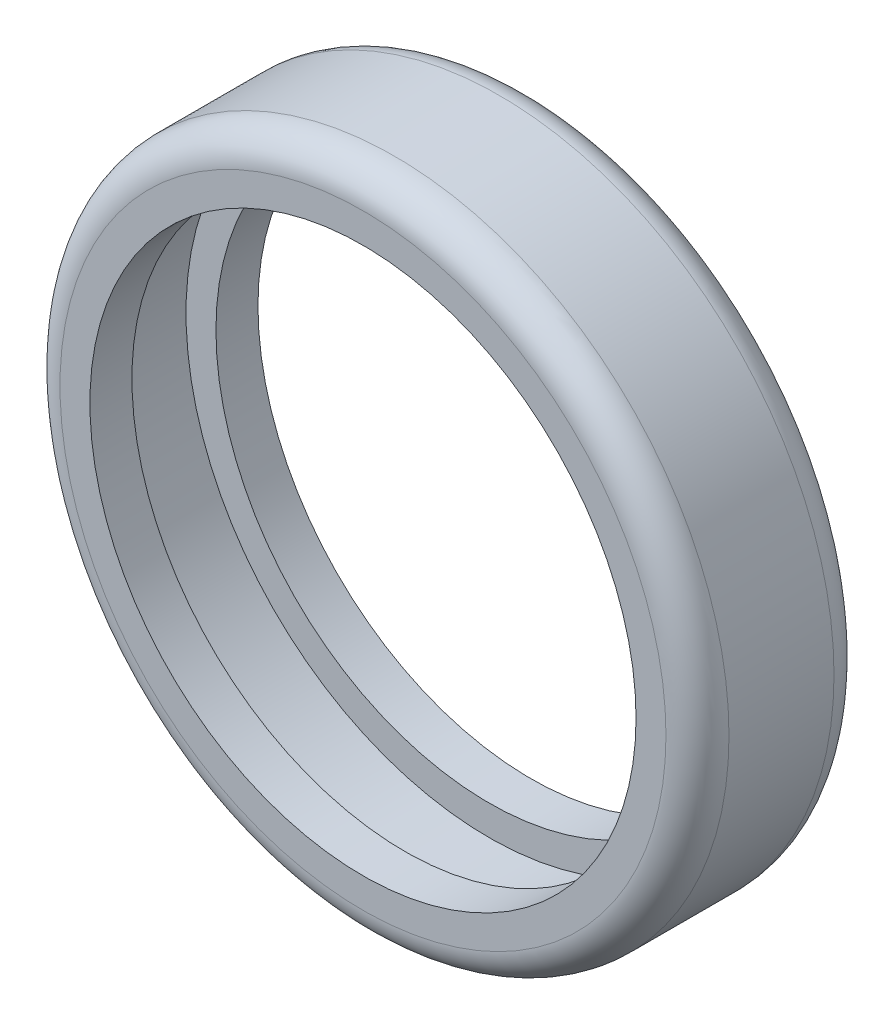
ISO-10303-21;
HEADER;
FILE_DESCRIPTION(('STEP AP214'),'2;1');
FILE_NAME('part.step','',(''),(''),'','','');
FILE_SCHEMA(('AUTOMOTIVE_DESIGN { 1 0 10303 214 1 1 1 1 }'));
ENDSEC;
DATA;
#1=APPLICATION_CONTEXT('core data for automotive mechanical design processes');
#2=APPLICATION_PROTOCOL_DEFINITION('international standard','automotive_design',2000,#1);
#3=PRODUCT_CONTEXT('',#1,'mechanical');
#4=PRODUCT('Part','Part','',(#3));
#5=PRODUCT_RELATED_PRODUCT_CATEGORY('part','',(#4));
#6=PRODUCT_DEFINITION_FORMATION('','',#4);
#7=PRODUCT_DEFINITION_CONTEXT('part definition',#1,'design');
#8=PRODUCT_DEFINITION('design','',#6,#7);
#9=PRODUCT_DEFINITION_SHAPE('','',#8);
#10=(LENGTH_UNIT() NAMED_UNIT(*) SI_UNIT(.MILLI.,.METRE.));
#11=(NAMED_UNIT(*) PLANE_ANGLE_UNIT() SI_UNIT($,.RADIAN.));
#12=(NAMED_UNIT(*) SI_UNIT($,.STERADIAN.) SOLID_ANGLE_UNIT());
#13=UNCERTAINTY_MEASURE_WITH_UNIT(LENGTH_MEASURE(1.E-05),#10,'distance_accuracy_value','');
#14=(GEOMETRIC_REPRESENTATION_CONTEXT(3) GLOBAL_UNCERTAINTY_ASSIGNED_CONTEXT((#13)) GLOBAL_UNIT_ASSIGNED_CONTEXT((#10,
#11,#12)) REPRESENTATION_CONTEXT('',''));
#15=CARTESIAN_POINT('',(0.,0.,0.));
#16=DIRECTION('',(0.,0.,1.));
#17=DIRECTION('',(1.,0.,0.));
#18=AXIS2_PLACEMENT_3D('',#15,#16,#17);
#19=CARTESIAN_POINT('',(0.,0.,8.));
#20=DIRECTION('',(0.,0.,-1.));
#21=DIRECTION('',(-1.,0.,0.));
#22=AXIS2_PLACEMENT_3D('',#19,#20,#21);
#23=CYLINDRICAL_SURFACE('',#22,28.85);
#24=CARTESIAN_POINT('',(0.,0.,8.));
#25=DIRECTION('',(0.,0.,1.));
#26=DIRECTION('',(1.,0.,0.));
#27=AXIS2_PLACEMENT_3D('',#24,#25,#26);
#28=CIRCLE('',#27,28.85);
#29=CARTESIAN_POINT('',(28.85,0.,8.));
#30=VERTEX_POINT('',#29);
#31=EDGE_CURVE('E58',#30,#30,#28,.T.);
#32=ORIENTED_EDGE('',*,*,#31,.T.);
#33=EDGE_LOOP('',(#32));
#34=FACE_BOUND('',#33,.T.);
#35=CARTESIAN_POINT('',(0.,0.,0.));
#36=DIRECTION('',(0.,0.,1.));
#37=DIRECTION('',(1.,0.,0.));
#38=AXIS2_PLACEMENT_3D('',#35,#36,#37);
#39=CIRCLE('',#38,28.85);
#40=CARTESIAN_POINT('',(28.85,0.,0.));
#41=VERTEX_POINT('',#40);
#42=EDGE_CURVE('E55',#41,#41,#39,.T.);
#43=ORIENTED_EDGE('',*,*,#42,.F.);
#44=EDGE_LOOP('',(#43));
#45=FACE_BOUND('',#44,.T.);
#46=ADVANCED_FACE('F35',(#34,#45),#23,.F.);
#47=CARTESIAN_POINT('',(0.,0.,8.));
#48=DIRECTION('',(0.,0.,-1.));
#49=DIRECTION('',(-1.,0.,0.));
#50=AXIS2_PLACEMENT_3D('',#47,#48,#49);
#51=CYLINDRICAL_SURFACE('',#50,31.85);
#52=CARTESIAN_POINT('',(0.,0.,9.));
#53=DIRECTION('',(0.,0.,1.));
#54=DIRECTION('',(1.,0.,0.));
#55=AXIS2_PLACEMENT_3D('',#52,#53,#54);
#56=CIRCLE('',#55,31.85);
#57=CARTESIAN_POINT('',(31.85,0.,9.));
#58=VERTEX_POINT('',#57);
#59=EDGE_CURVE('E42',#58,#58,#56,.F.);
#60=ORIENTED_EDGE('',*,*,#59,.T.);
#61=EDGE_LOOP('',(#60));
#62=FACE_BOUND('',#61,.T.);
#63=CARTESIAN_POINT('',(0.,0.,-1.));
#64=DIRECTION('',(0.,0.,-1.));
#65=DIRECTION('',(-1.,0.,0.));
#66=AXIS2_PLACEMENT_3D('',#63,#64,#65);
#67=CIRCLE('',#66,31.85);
#68=CARTESIAN_POINT('',(-31.85,0.,-1.));
#69=VERTEX_POINT('',#68);
#70=EDGE_CURVE('E46',#69,#69,#67,.F.);
#71=ORIENTED_EDGE('',*,*,#70,.T.);
#72=EDGE_LOOP('',(#71));
#73=FACE_BOUND('',#72,.T.);
#74=ADVANCED_FACE('F91',(#62,#73),#51,.T.);
#75=CARTESIAN_POINT('',(0.,0.,8.));
#76=DIRECTION('',(0.,0.,1.));
#77=DIRECTION('',(1.,0.,0.));
#78=AXIS2_PLACEMENT_3D('',#75,#76,#77);
#79=PLANE('',#78);
#80=CARTESIAN_POINT('',(0.,0.,8.));
#81=DIRECTION('',(0.,0.,1.));
#82=DIRECTION('',(1.,0.,0.));
#83=AXIS2_PLACEMENT_3D('',#80,#81,#82);
#84=CIRCLE('',#83,26.);
#85=CARTESIAN_POINT('',(26.,0.,8.));
#86=VERTEX_POINT('',#85);
#87=EDGE_CURVE('E62',#86,#86,#84,.T.);
#88=ORIENTED_EDGE('',*,*,#87,.T.);
#89=EDGE_LOOP('',(#88));
#90=FACE_BOUND('',#89,.T.);
#91=ORIENTED_EDGE('',*,*,#31,.F.);
#92=EDGE_LOOP('',(#91));
#93=FACE_BOUND('',#92,.T.);
#94=ADVANCED_FACE('F97',(#90,#93),#79,.F.);
#95=CARTESIAN_POINT('',(0.,0.,12.));
#96=DIRECTION('',(0.,0.,1.));
#97=DIRECTION('',(1.,0.,0.));
#98=AXIS2_PLACEMENT_3D('',#95,#96,#97);
#99=PLANE('',#98);
#100=CARTESIAN_POINT('',(0.,0.,12.));
#101=DIRECTION('',(0.,0.,1.));
#102=DIRECTION('',(1.,0.,0.));
#103=AXIS2_PLACEMENT_3D('',#100,#101,#102);
#104=CIRCLE('',#103,28.85);
#105=CARTESIAN_POINT('',(28.85,0.,12.));
#106=VERTEX_POINT('',#105);
#107=EDGE_CURVE('E50',#106,#106,#104,.T.);
#108=ORIENTED_EDGE('',*,*,#107,.T.);
#109=EDGE_LOOP('',(#108));
#110=FACE_BOUND('',#109,.T.);
#111=CARTESIAN_POINT('',(0.,0.,12.));
#112=DIRECTION('',(0.,0.,1.));
#113=DIRECTION('',(1.,0.,0.));
#114=AXIS2_PLACEMENT_3D('',#111,#112,#113);
#115=CIRCLE('',#114,26.);
#116=CARTESIAN_POINT('',(26.,0.,12.));
#117=VERTEX_POINT('',#116);
#118=EDGE_CURVE('E61',#117,#117,#115,.T.);
#119=ORIENTED_EDGE('',*,*,#118,.F.);
#120=EDGE_LOOP('',(#119));
#121=FACE_BOUND('',#120,.T.);
#122=ADVANCED_FACE('F110',(#110,#121),#99,.T.);
#123=CARTESIAN_POINT('',(0.,0.,12.));
#124=DIRECTION('',(0.,0.,-1.));
#125=DIRECTION('',(-1.,0.,0.));
#126=AXIS2_PLACEMENT_3D('',#123,#124,#125);
#127=CYLINDRICAL_SURFACE('',#126,26.);
#128=ORIENTED_EDGE('',*,*,#118,.T.);
#129=EDGE_LOOP('',(#128));
#130=FACE_BOUND('',#129,.T.);
#131=ORIENTED_EDGE('',*,*,#87,.F.);
#132=EDGE_LOOP('',(#131));
#133=FACE_BOUND('',#132,.T.);
#134=ADVANCED_FACE('F87',(#130,#133),#127,.F.);
#135=CARTESIAN_POINT('',(0.,0.,0.));
#136=DIRECTION('',(0.,0.,-1.));
#137=DIRECTION('',(-1.,0.,0.));
#138=AXIS2_PLACEMENT_3D('',#135,#136,#137);
#139=PLANE('',#138);
#140=CARTESIAN_POINT('',(0.,0.,0.));
#141=DIRECTION('',(0.,0.,-1.));
#142=DIRECTION('',(-1.,0.,0.));
#143=AXIS2_PLACEMENT_3D('',#140,#141,#142);
#144=CIRCLE('',#143,26.);
#145=CARTESIAN_POINT('',(-26.,0.,0.));
#146=VERTEX_POINT('',#145);
#147=EDGE_CURVE('E68',#146,#146,#144,.T.);
#148=ORIENTED_EDGE('',*,*,#147,.T.);
#149=EDGE_LOOP('',(#148));
#150=FACE_BOUND('',#149,.T.);
#151=ORIENTED_EDGE('',*,*,#42,.T.);
#152=EDGE_LOOP('',(#151));
#153=FACE_BOUND('',#152,.T.);
#154=ADVANCED_FACE('F79',(#150,#153),#139,.F.);
#155=CARTESIAN_POINT('',(0.,0.,-4.));
#156=DIRECTION('',(0.,0.,-1.));
#157=DIRECTION('',(-1.,0.,0.));
#158=AXIS2_PLACEMENT_3D('',#155,#156,#157);
#159=PLANE('',#158);
#160=CARTESIAN_POINT('',(0.,0.,-4.));
#161=DIRECTION('',(0.,0.,-1.));
#162=DIRECTION('',(-1.,0.,0.));
#163=AXIS2_PLACEMENT_3D('',#160,#161,#162);
#164=CIRCLE('',#163,28.85);
#165=CARTESIAN_POINT('',(-28.85,0.,-4.));
#166=VERTEX_POINT('',#165);
#167=EDGE_CURVE('E10',#166,#166,#164,.T.);
#168=ORIENTED_EDGE('',*,*,#167,.T.);
#169=EDGE_LOOP('',(#168));
#170=FACE_BOUND('',#169,.T.);
#171=CARTESIAN_POINT('',(0.,0.,-4.));
#172=DIRECTION('',(0.,0.,-1.));
#173=DIRECTION('',(-1.,0.,0.));
#174=AXIS2_PLACEMENT_3D('',#171,#172,#173);
#175=CIRCLE('',#174,26.);
#176=CARTESIAN_POINT('',(-26.,0.,-4.));
#177=VERTEX_POINT('',#176);
#178=EDGE_CURVE('E65',#177,#177,#175,.T.);
#179=ORIENTED_EDGE('',*,*,#178,.F.);
#180=EDGE_LOOP('',(#179));
#181=FACE_BOUND('',#180,.T.);
#182=ADVANCED_FACE('F77',(#170,#181),#159,.T.);
#183=CARTESIAN_POINT('',(0.,0.,-4.));
#184=DIRECTION('',(0.,0.,1.));
#185=DIRECTION('',(1.,0.,0.));
#186=AXIS2_PLACEMENT_3D('',#183,#184,#185);
#187=CYLINDRICAL_SURFACE('',#186,26.);
#188=ORIENTED_EDGE('',*,*,#178,.T.);
#189=EDGE_LOOP('',(#188));
#190=FACE_BOUND('',#189,.T.);
#191=ORIENTED_EDGE('',*,*,#147,.F.);
#192=EDGE_LOOP('',(#191));
#193=FACE_BOUND('',#192,.T.);
#194=ADVANCED_FACE('F74',(#190,#193),#187,.F.);
#195=CARTESIAN_POINT('',(0.,0.,9.));
#196=DIRECTION('',(0.,0.,1.));
#197=DIRECTION('',(1.,0.,0.));
#198=AXIS2_PLACEMENT_3D('',#195,#196,#197);
#199=TOROIDAL_SURFACE('',#198,28.85,3.);
#200=ORIENTED_EDGE('',*,*,#59,.F.);
#201=EDGE_LOOP('',(#200));
#202=FACE_BOUND('',#201,.T.);
#203=ORIENTED_EDGE('',*,*,#107,.F.);
#204=EDGE_LOOP('',(#203));
#205=FACE_BOUND('',#204,.T.);
#206=ADVANCED_FACE('F85',(#202,#205),#199,.T.);
#207=CARTESIAN_POINT('',(0.,0.,-1.));
#208=DIRECTION('',(0.,0.,-1.));
#209=DIRECTION('',(-1.,0.,0.));
#210=AXIS2_PLACEMENT_3D('',#207,#208,#209);
#211=TOROIDAL_SURFACE('',#210,28.85,3.);
#212=ORIENTED_EDGE('',*,*,#70,.F.);
#213=EDGE_LOOP('',(#212));
#214=FACE_BOUND('',#213,.T.);
#215=ORIENTED_EDGE('',*,*,#167,.F.);
#216=EDGE_LOOP('',(#215));
#217=FACE_BOUND('',#216,.T.);
#218=ADVANCED_FACE('F37',(#214,#217),#211,.T.);
#219=CLOSED_SHELL('',(#46,#74,#94,#122,#134,#154,#182,#194,#206,#218));
#220=MANIFOLD_SOLID_BREP('B2',#219);
#221=ADVANCED_BREP_SHAPE_REPRESENTATION('',(#18,#220),#14);
#222=SHAPE_DEFINITION_REPRESENTATION(#9,#221);
ENDSEC;
END-ISO-10303-21;
